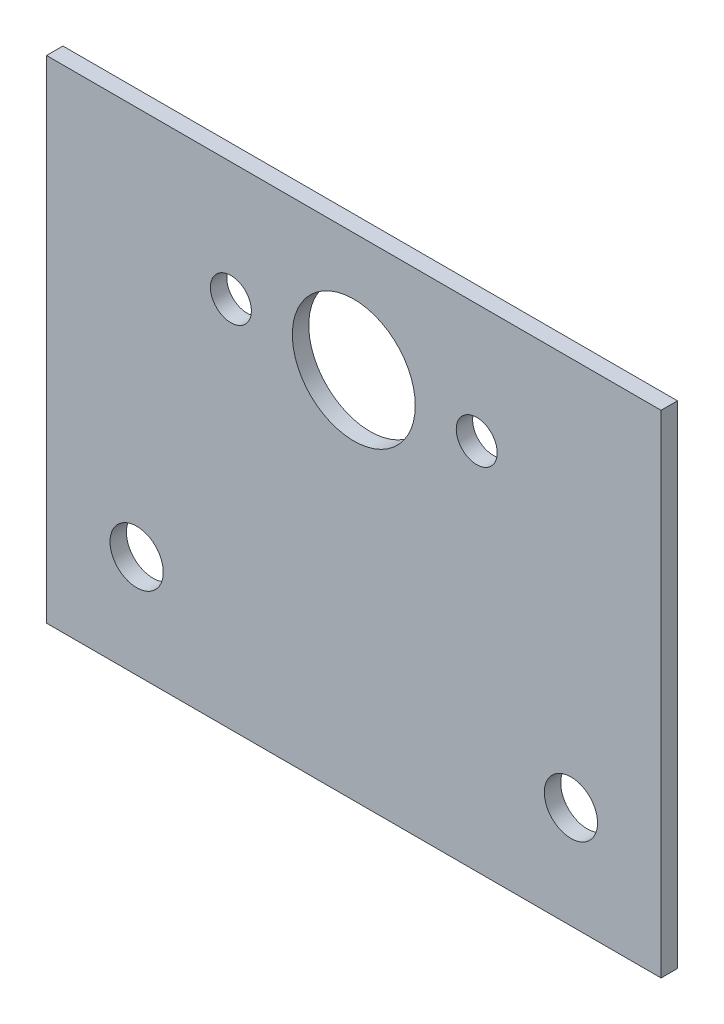
ISO-10303-21;
HEADER;
FILE_DESCRIPTION(('STEP AP214'),'2;1');
FILE_NAME('part.step','',(''),(''),'','','');
FILE_SCHEMA(('AUTOMOTIVE_DESIGN { 1 0 10303 214 1 1 1 1 }'));
ENDSEC;
DATA;
#1=APPLICATION_CONTEXT('core data for automotive mechanical design processes');
#2=APPLICATION_PROTOCOL_DEFINITION('international standard','automotive_design',2000,#1);
#3=PRODUCT_CONTEXT('',#1,'mechanical');
#4=PRODUCT('Part','Part','',(#3));
#5=PRODUCT_RELATED_PRODUCT_CATEGORY('part','',(#4));
#6=PRODUCT_DEFINITION_FORMATION('','',#4);
#7=PRODUCT_DEFINITION_CONTEXT('part definition',#1,'design');
#8=PRODUCT_DEFINITION('design','',#6,#7);
#9=PRODUCT_DEFINITION_SHAPE('','',#8);
#10=(LENGTH_UNIT() NAMED_UNIT(*) SI_UNIT(.MILLI.,.METRE.));
#11=(NAMED_UNIT(*) PLANE_ANGLE_UNIT() SI_UNIT($,.RADIAN.));
#12=(NAMED_UNIT(*) SI_UNIT($,.STERADIAN.) SOLID_ANGLE_UNIT());
#13=UNCERTAINTY_MEASURE_WITH_UNIT(LENGTH_MEASURE(1.E-05),#10,'distance_accuracy_value','');
#14=(GEOMETRIC_REPRESENTATION_CONTEXT(3) GLOBAL_UNCERTAINTY_ASSIGNED_CONTEXT((#13)) GLOBAL_UNIT_ASSIGNED_CONTEXT((#10,
#11,#12)) REPRESENTATION_CONTEXT('',''));
#15=CARTESIAN_POINT('',(0.,0.,0.));
#16=DIRECTION('',(0.,0.,1.));
#17=DIRECTION('',(1.,0.,0.));
#18=AXIS2_PLACEMENT_3D('',#15,#16,#17);
#19=CARTESIAN_POINT('',(0.,0.,2.));
#20=DIRECTION('',(0.,0.,-1.));
#21=DIRECTION('',(-1.,0.,0.));
#22=AXIS2_PLACEMENT_3D('',#19,#20,#21);
#23=PLANE('',#22);
#24=DIRECTION('',(0.,-1.,0.));
#25=VECTOR('',#24,1.);
#26=CARTESIAN_POINT('',(0.,0.,2.));
#27=LINE('',#26,#25);
#28=CARTESIAN_POINT('',(0.,60.,2.));
#29=VERTEX_POINT('',#28);
#30=CARTESIAN_POINT('',(0.,0.,2.));
#31=VERTEX_POINT('',#30);
#32=EDGE_CURVE('E89',#29,#31,#27,.T.);
#33=ORIENTED_EDGE('',*,*,#32,.T.);
#34=DIRECTION('',(1.,0.,0.));
#35=VECTOR('',#34,1.);
#36=CARTESIAN_POINT('',(0.,0.,2.));
#37=LINE('',#36,#35);
#38=CARTESIAN_POINT('',(75.,0.,2.));
#39=VERTEX_POINT('',#38);
#40=EDGE_CURVE('E84',#31,#39,#37,.T.);
#41=ORIENTED_EDGE('',*,*,#40,.T.);
#42=DIRECTION('',(0.,1.,0.));
#43=VECTOR('',#42,1.);
#44=CARTESIAN_POINT('',(75.,0.,2.));
#45=LINE('',#44,#43);
#46=CARTESIAN_POINT('',(75.,60.,2.));
#47=VERTEX_POINT('',#46);
#48=EDGE_CURVE('E87',#39,#47,#45,.T.);
#49=ORIENTED_EDGE('',*,*,#48,.T.);
#50=DIRECTION('',(-1.,0.,0.));
#51=VECTOR('',#50,1.);
#52=CARTESIAN_POINT('',(0.,60.,2.));
#53=LINE('',#52,#51);
#54=EDGE_CURVE('E54',#47,#29,#53,.T.);
#55=ORIENTED_EDGE('',*,*,#54,.T.);
#56=EDGE_LOOP('',(#33,#41,#49,#55));
#57=FACE_BOUND('',#56,.T.);
#58=CARTESIAN_POINT('',(37.5,45.5,2.));
#59=DIRECTION('',(0.,0.,1.));
#60=DIRECTION('',(1.,0.,0.));
#61=AXIS2_PLACEMENT_3D('',#58,#59,#60);
#62=CIRCLE('',#61,7.5);
#63=CARTESIAN_POINT('',(45.,45.5,2.));
#64=VERTEX_POINT('',#63);
#65=EDGE_CURVE('E104',#64,#64,#62,.T.);
#66=ORIENTED_EDGE('',*,*,#65,.F.);
#67=EDGE_LOOP('',(#66));
#68=FACE_BOUND('',#67,.T.);
#69=CARTESIAN_POINT('',(64.,12.5,2.));
#70=DIRECTION('',(0.,0.,1.));
#71=DIRECTION('',(1.,0.,0.));
#72=AXIS2_PLACEMENT_3D('',#69,#70,#71);
#73=CIRCLE('',#72,3.24999999999999);
#74=CARTESIAN_POINT('',(67.25,12.5,2.));
#75=VERTEX_POINT('',#74);
#76=EDGE_CURVE('E119',#75,#75,#73,.T.);
#77=ORIENTED_EDGE('',*,*,#76,.F.);
#78=EDGE_LOOP('',(#77));
#79=FACE_BOUND('',#78,.T.);
#80=CARTESIAN_POINT('',(11.,12.5,2.));
#81=DIRECTION('',(0.,0.,1.));
#82=DIRECTION('',(-1.,0.,0.));
#83=AXIS2_PLACEMENT_3D('',#80,#81,#82);
#84=CIRCLE('',#83,3.24999999999999);
#85=CARTESIAN_POINT('',(7.75,12.5,2.));
#86=VERTEX_POINT('',#85);
#87=EDGE_CURVE('E125',#86,#86,#84,.T.);
#88=ORIENTED_EDGE('',*,*,#87,.F.);
#89=EDGE_LOOP('',(#88));
#90=FACE_BOUND('',#89,.T.);
#91=CARTESIAN_POINT('',(22.5,45.5,2.));
#92=DIRECTION('',(0.,0.,1.));
#93=DIRECTION('',(1.,0.,0.));
#94=AXIS2_PLACEMENT_3D('',#91,#92,#93);
#95=CIRCLE('',#94,2.5);
#96=CARTESIAN_POINT('',(25.,45.5,2.));
#97=VERTEX_POINT('',#96);
#98=EDGE_CURVE('E131',#97,#97,#95,.T.);
#99=ORIENTED_EDGE('',*,*,#98,.F.);
#100=EDGE_LOOP('',(#99));
#101=FACE_BOUND('',#100,.T.);
#102=CARTESIAN_POINT('',(52.5,45.5,2.));
#103=DIRECTION('',(0.,0.,1.));
#104=DIRECTION('',(-1.,0.,0.));
#105=AXIS2_PLACEMENT_3D('',#102,#103,#104);
#106=CIRCLE('',#105,2.5);
#107=CARTESIAN_POINT('',(50.,45.5,2.));
#108=VERTEX_POINT('',#107);
#109=EDGE_CURVE('E137',#108,#108,#106,.T.);
#110=ORIENTED_EDGE('',*,*,#109,.F.);
#111=EDGE_LOOP('',(#110));
#112=FACE_BOUND('',#111,.T.);
#113=ADVANCED_FACE('F37',(#57,#68,#79,#90,#101,#112),#23,.F.);
#114=CARTESIAN_POINT('',(0.,0.,0.));
#115=DIRECTION('',(0.,0.,-1.));
#116=DIRECTION('',(-1.,0.,0.));
#117=AXIS2_PLACEMENT_3D('',#114,#115,#116);
#118=PLANE('',#117);
#119=CARTESIAN_POINT('',(22.5,45.5,0.));
#120=DIRECTION('',(0.,0.,1.));
#121=DIRECTION('',(1.,0.,0.));
#122=AXIS2_PLACEMENT_3D('',#119,#120,#121);
#123=CIRCLE('',#122,2.5);
#124=CARTESIAN_POINT('',(25.,45.5,0.));
#125=VERTEX_POINT('',#124);
#126=EDGE_CURVE('E134',#125,#125,#123,.T.);
#127=ORIENTED_EDGE('',*,*,#126,.T.);
#128=EDGE_LOOP('',(#127));
#129=FACE_BOUND('',#128,.T.);
#130=CARTESIAN_POINT('',(64.,12.5,0.));
#131=DIRECTION('',(0.,0.,1.));
#132=DIRECTION('',(1.,0.,0.));
#133=AXIS2_PLACEMENT_3D('',#130,#131,#132);
#134=CIRCLE('',#133,3.24999999999999);
#135=CARTESIAN_POINT('',(67.25,12.5,0.));
#136=VERTEX_POINT('',#135);
#137=EDGE_CURVE('E122',#136,#136,#134,.T.);
#138=ORIENTED_EDGE('',*,*,#137,.T.);
#139=EDGE_LOOP('',(#138));
#140=FACE_BOUND('',#139,.T.);
#141=DIRECTION('',(0.,-1.,0.));
#142=VECTOR('',#141,1.);
#143=CARTESIAN_POINT('',(0.,0.,0.));
#144=LINE('',#143,#142);
#145=CARTESIAN_POINT('',(0.,60.,0.));
#146=VERTEX_POINT('',#145);
#147=CARTESIAN_POINT('',(0.,0.,0.));
#148=VERTEX_POINT('',#147);
#149=EDGE_CURVE('E101',#146,#148,#144,.T.);
#150=ORIENTED_EDGE('',*,*,#149,.F.);
#151=DIRECTION('',(-1.,0.,0.));
#152=VECTOR('',#151,1.);
#153=CARTESIAN_POINT('',(0.,60.,0.));
#154=LINE('',#153,#152);
#155=CARTESIAN_POINT('',(75.,60.,0.));
#156=VERTEX_POINT('',#155);
#157=EDGE_CURVE('E77',#156,#146,#154,.T.);
#158=ORIENTED_EDGE('',*,*,#157,.F.);
#159=DIRECTION('',(0.,1.,0.));
#160=VECTOR('',#159,1.);
#161=CARTESIAN_POINT('',(75.,0.,0.));
#162=LINE('',#161,#160);
#163=CARTESIAN_POINT('',(75.,0.,0.));
#164=VERTEX_POINT('',#163);
#165=EDGE_CURVE('E71',#164,#156,#162,.T.);
#166=ORIENTED_EDGE('',*,*,#165,.F.);
#167=DIRECTION('',(1.,0.,0.));
#168=VECTOR('',#167,1.);
#169=CARTESIAN_POINT('',(0.,0.,0.));
#170=LINE('',#169,#168);
#171=EDGE_CURVE('E93',#148,#164,#170,.T.);
#172=ORIENTED_EDGE('',*,*,#171,.F.);
#173=EDGE_LOOP('',(#150,#158,#166,#172));
#174=FACE_BOUND('',#173,.T.);
#175=CARTESIAN_POINT('',(37.5,45.5,0.));
#176=DIRECTION('',(0.,0.,1.));
#177=DIRECTION('',(1.,0.,0.));
#178=AXIS2_PLACEMENT_3D('',#175,#176,#177);
#179=CIRCLE('',#178,7.5);
#180=CARTESIAN_POINT('',(45.,45.5,0.));
#181=VERTEX_POINT('',#180);
#182=EDGE_CURVE('E116',#181,#181,#179,.T.);
#183=ORIENTED_EDGE('',*,*,#182,.T.);
#184=EDGE_LOOP('',(#183));
#185=FACE_BOUND('',#184,.T.);
#186=CARTESIAN_POINT('',(11.,12.5,0.));
#187=DIRECTION('',(0.,0.,1.));
#188=DIRECTION('',(-1.,0.,0.));
#189=AXIS2_PLACEMENT_3D('',#186,#187,#188);
#190=CIRCLE('',#189,3.24999999999999);
#191=CARTESIAN_POINT('',(7.75,12.5,0.));
#192=VERTEX_POINT('',#191);
#193=EDGE_CURVE('E128',#192,#192,#190,.T.);
#194=ORIENTED_EDGE('',*,*,#193,.T.);
#195=EDGE_LOOP('',(#194));
#196=FACE_BOUND('',#195,.T.);
#197=CARTESIAN_POINT('',(52.5,45.5,0.));
#198=DIRECTION('',(0.,0.,1.));
#199=DIRECTION('',(-1.,0.,0.));
#200=AXIS2_PLACEMENT_3D('',#197,#198,#199);
#201=CIRCLE('',#200,2.5);
#202=CARTESIAN_POINT('',(50.,45.5,0.));
#203=VERTEX_POINT('',#202);
#204=EDGE_CURVE('E140',#203,#203,#201,.T.);
#205=ORIENTED_EDGE('',*,*,#204,.T.);
#206=EDGE_LOOP('',(#205));
#207=FACE_BOUND('',#206,.T.);
#208=ADVANCED_FACE('F112',(#129,#140,#174,#185,#196,#207),#118,.T.);
#209=CARTESIAN_POINT('',(0.,0.,2.));
#210=DIRECTION('',(1.,0.,0.));
#211=DIRECTION('',(0.,0.,-1.));
#212=AXIS2_PLACEMENT_3D('',#209,#210,#211);
#213=PLANE('',#212);
#214=ORIENTED_EDGE('',*,*,#149,.T.);
#215=DIRECTION('',(0.,0.,-1.));
#216=VECTOR('',#215,1.);
#217=CARTESIAN_POINT('',(0.,0.,2.));
#218=LINE('',#217,#216);
#219=EDGE_CURVE('E11',#31,#148,#218,.T.);
#220=ORIENTED_EDGE('',*,*,#219,.F.);
#221=ORIENTED_EDGE('',*,*,#32,.F.);
#222=DIRECTION('',(0.,0.,-1.));
#223=VECTOR('',#222,1.);
#224=CARTESIAN_POINT('',(0.,60.,2.));
#225=LINE('',#224,#223);
#226=EDGE_CURVE('E97',#29,#146,#225,.T.);
#227=ORIENTED_EDGE('',*,*,#226,.T.);
#228=EDGE_LOOP('',(#214,#220,#221,#227));
#229=FACE_BOUND('',#228,.T.);
#230=ADVANCED_FACE('F39',(#229),#213,.F.);
#231=CARTESIAN_POINT('',(0.,0.,2.));
#232=DIRECTION('',(0.,1.,0.));
#233=DIRECTION('',(0.,0.,1.));
#234=AXIS2_PLACEMENT_3D('',#231,#232,#233);
#235=PLANE('',#234);
#236=ORIENTED_EDGE('',*,*,#171,.T.);
#237=DIRECTION('',(0.,0.,-1.));
#238=VECTOR('',#237,1.);
#239=CARTESIAN_POINT('',(75.,0.,2.));
#240=LINE('',#239,#238);
#241=EDGE_CURVE('E46',#39,#164,#240,.T.);
#242=ORIENTED_EDGE('',*,*,#241,.F.);
#243=ORIENTED_EDGE('',*,*,#40,.F.);
#244=ORIENTED_EDGE('',*,*,#219,.T.);
#245=EDGE_LOOP('',(#236,#242,#243,#244));
#246=FACE_BOUND('',#245,.T.);
#247=ADVANCED_FACE('F92',(#246),#235,.F.);
#248=CARTESIAN_POINT('',(75.,0.,2.));
#249=DIRECTION('',(-1.,0.,0.));
#250=DIRECTION('',(0.,0.,1.));
#251=AXIS2_PLACEMENT_3D('',#248,#249,#250);
#252=PLANE('',#251);
#253=ORIENTED_EDGE('',*,*,#165,.T.);
#254=DIRECTION('',(0.,0.,-1.));
#255=VECTOR('',#254,1.);
#256=CARTESIAN_POINT('',(75.,60.,2.));
#257=LINE('',#256,#255);
#258=EDGE_CURVE('E94',#47,#156,#257,.T.);
#259=ORIENTED_EDGE('',*,*,#258,.F.);
#260=ORIENTED_EDGE('',*,*,#48,.F.);
#261=ORIENTED_EDGE('',*,*,#241,.T.);
#262=EDGE_LOOP('',(#253,#259,#260,#261));
#263=FACE_BOUND('',#262,.T.);
#264=ADVANCED_FACE('F95',(#263),#252,.F.);
#265=CARTESIAN_POINT('',(0.,60.,2.));
#266=DIRECTION('',(0.,-1.,0.));
#267=DIRECTION('',(0.,0.,-1.));
#268=AXIS2_PLACEMENT_3D('',#265,#266,#267);
#269=PLANE('',#268);
#270=ORIENTED_EDGE('',*,*,#157,.T.);
#271=ORIENTED_EDGE('',*,*,#226,.F.);
#272=ORIENTED_EDGE('',*,*,#54,.F.);
#273=ORIENTED_EDGE('',*,*,#258,.T.);
#274=EDGE_LOOP('',(#270,#271,#272,#273));
#275=FACE_BOUND('',#274,.T.);
#276=ADVANCED_FACE('F109',(#275),#269,.F.);
#277=CARTESIAN_POINT('',(37.5,45.5,2.));
#278=DIRECTION('',(0.,0.,-1.));
#279=DIRECTION('',(-1.,0.,0.));
#280=AXIS2_PLACEMENT_3D('',#277,#278,#279);
#281=CYLINDRICAL_SURFACE('',#280,7.5);
#282=ORIENTED_EDGE('',*,*,#65,.T.);
#283=EDGE_LOOP('',(#282));
#284=FACE_BOUND('',#283,.T.);
#285=ORIENTED_EDGE('',*,*,#182,.F.);
#286=EDGE_LOOP('',(#285));
#287=FACE_BOUND('',#286,.T.);
#288=ADVANCED_FACE('F157',(#284,#287),#281,.F.);
#289=CARTESIAN_POINT('',(64.,12.5,2.));
#290=DIRECTION('',(0.,0.,-1.));
#291=DIRECTION('',(-1.,0.,0.));
#292=AXIS2_PLACEMENT_3D('',#289,#290,#291);
#293=CYLINDRICAL_SURFACE('',#292,3.24999999999999);
#294=ORIENTED_EDGE('',*,*,#76,.T.);
#295=EDGE_LOOP('',(#294));
#296=FACE_BOUND('',#295,.T.);
#297=ORIENTED_EDGE('',*,*,#137,.F.);
#298=EDGE_LOOP('',(#297));
#299=FACE_BOUND('',#298,.T.);
#300=ADVANCED_FACE('F211',(#296,#299),#293,.F.);
#301=CARTESIAN_POINT('',(11.,12.5,2.));
#302=DIRECTION('',(0.,0.,-1.));
#303=DIRECTION('',(-1.,0.,0.));
#304=AXIS2_PLACEMENT_3D('',#301,#302,#303);
#305=CYLINDRICAL_SURFACE('',#304,3.24999999999999);
#306=ORIENTED_EDGE('',*,*,#87,.T.);
#307=EDGE_LOOP('',(#306));
#308=FACE_BOUND('',#307,.T.);
#309=ORIENTED_EDGE('',*,*,#193,.F.);
#310=EDGE_LOOP('',(#309));
#311=FACE_BOUND('',#310,.T.);
#312=ADVANCED_FACE('F220',(#308,#311),#305,.F.);
#313=CARTESIAN_POINT('',(22.5,45.5,2.));
#314=DIRECTION('',(0.,0.,-1.));
#315=DIRECTION('',(-1.,0.,0.));
#316=AXIS2_PLACEMENT_3D('',#313,#314,#315);
#317=CYLINDRICAL_SURFACE('',#316,2.5);
#318=ORIENTED_EDGE('',*,*,#98,.T.);
#319=EDGE_LOOP('',(#318));
#320=FACE_BOUND('',#319,.T.);
#321=ORIENTED_EDGE('',*,*,#126,.F.);
#322=EDGE_LOOP('',(#321));
#323=FACE_BOUND('',#322,.T.);
#324=ADVANCED_FACE('F229',(#320,#323),#317,.F.);
#325=CARTESIAN_POINT('',(52.5,45.5,2.));
#326=DIRECTION('',(0.,0.,-1.));
#327=DIRECTION('',(-1.,0.,0.));
#328=AXIS2_PLACEMENT_3D('',#325,#326,#327);
#329=CYLINDRICAL_SURFACE('',#328,2.5);
#330=ORIENTED_EDGE('',*,*,#109,.T.);
#331=EDGE_LOOP('',(#330));
#332=FACE_BOUND('',#331,.T.);
#333=ORIENTED_EDGE('',*,*,#204,.F.);
#334=EDGE_LOOP('',(#333));
#335=FACE_BOUND('',#334,.T.);
#336=ADVANCED_FACE('F146',(#332,#335),#329,.F.);
#337=CLOSED_SHELL('',(#113,#208,#230,#247,#264,#276,#288,#300,#312,#324,#336));
#338=MANIFOLD_SOLID_BREP('B2',#337);
#339=ADVANCED_BREP_SHAPE_REPRESENTATION('',(#18,#338),#14);
#340=SHAPE_DEFINITION_REPRESENTATION(#9,#339);
ENDSEC;
END-ISO-10303-21;
